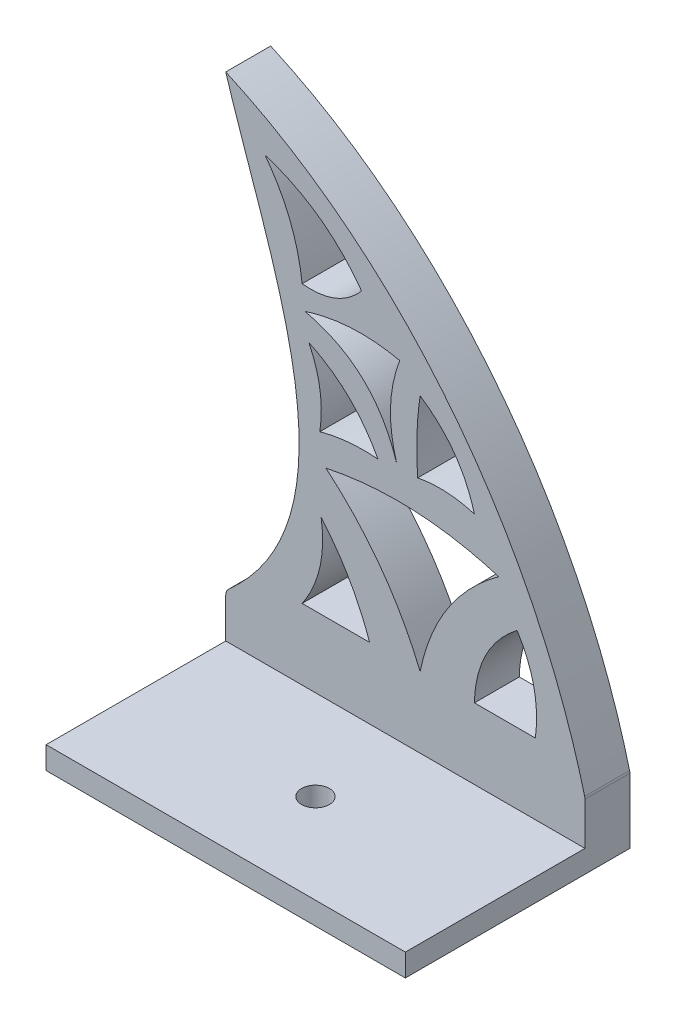
ISO-10303-21;
HEADER;
FILE_DESCRIPTION(('STEP AP214'),'2;1');
FILE_NAME('part.step','',(''),(''),'','','');
FILE_SCHEMA(('AUTOMOTIVE_DESIGN { 1 0 10303 214 1 1 1 1 }'));
ENDSEC;
DATA;
#1=APPLICATION_CONTEXT('core data for automotive mechanical design processes');
#2=APPLICATION_PROTOCOL_DEFINITION('international standard','automotive_design',2000,#1);
#3=PRODUCT_CONTEXT('',#1,'mechanical');
#4=PRODUCT('Part','Part','',(#3));
#5=PRODUCT_RELATED_PRODUCT_CATEGORY('part','',(#4));
#6=PRODUCT_DEFINITION_FORMATION('','',#4);
#7=PRODUCT_DEFINITION_CONTEXT('part definition',#1,'design');
#8=PRODUCT_DEFINITION('design','',#6,#7);
#9=PRODUCT_DEFINITION_SHAPE('','',#8);
#10=(LENGTH_UNIT() NAMED_UNIT(*) SI_UNIT(.MILLI.,.METRE.));
#11=(NAMED_UNIT(*) PLANE_ANGLE_UNIT() SI_UNIT($,.RADIAN.));
#12=(NAMED_UNIT(*) SI_UNIT($,.STERADIAN.) SOLID_ANGLE_UNIT());
#13=UNCERTAINTY_MEASURE_WITH_UNIT(LENGTH_MEASURE(1.E-05),#10,'distance_accuracy_value','');
#14=(GEOMETRIC_REPRESENTATION_CONTEXT(3) GLOBAL_UNCERTAINTY_ASSIGNED_CONTEXT((#13)) GLOBAL_UNIT_ASSIGNED_CONTEXT((#10,
#11,#12)) REPRESENTATION_CONTEXT('',''));
#15=CARTESIAN_POINT('',(0.,0.,0.));
#16=DIRECTION('',(0.,0.,1.));
#17=DIRECTION('',(1.,0.,0.));
#18=AXIS2_PLACEMENT_3D('',#15,#16,#17);
#19=CARTESIAN_POINT('',(0.,0.,12.7));
#20=DIRECTION('',(-1.,0.,0.));
#21=DIRECTION('',(0.,0.,1.));
#22=AXIS2_PLACEMENT_3D('',#19,#20,#21);
#23=PLANE('',#22);
#24=DIRECTION('',(0.,1.,0.));
#25=VECTOR('',#24,1.);
#26=CARTESIAN_POINT('',(0.,0.,0.));
#27=LINE('',#26,#25);
#28=CARTESIAN_POINT('',(0.,133.663922723156,0.));
#29=VERTEX_POINT('',#28);
#30=CARTESIAN_POINT('',(0.,151.251284081008,0.));
#31=VERTEX_POINT('',#30);
#32=EDGE_CURVE('E365',#29,#31,#27,.T.);
#33=ORIENTED_EDGE('',*,*,#32,.F.);
#34=DIRECTION('',(0.,0.,1.));
#35=VECTOR('',#34,1.);
#36=CARTESIAN_POINT('',(0.,133.663922723156,0.));
#37=LINE('',#36,#35);
#38=CARTESIAN_POINT('',(0.,133.663922723156,63.5));
#39=VERTEX_POINT('',#38);
#40=EDGE_CURVE('E71',#29,#39,#37,.T.);
#41=ORIENTED_EDGE('',*,*,#40,.T.);
#42=DIRECTION('',(0.,-1.,0.));
#43=VECTOR('',#42,1.);
#44=CARTESIAN_POINT('',(0.,133.663922723156,63.5));
#45=LINE('',#44,#43);
#46=CARTESIAN_POINT('',(0.,140.013922723156,63.5));
#47=VERTEX_POINT('',#46);
#48=EDGE_CURVE('E255',#47,#39,#45,.T.);
#49=ORIENTED_EDGE('',*,*,#48,.F.);
#50=DIRECTION('',(0.,0.,-1.));
#51=VECTOR('',#50,1.);
#52=CARTESIAN_POINT('',(0.,140.013922723156,63.5));
#53=LINE('',#52,#51);
#54=CARTESIAN_POINT('',(0.,140.013922723156,12.7));
#55=VERTEX_POINT('',#54);
#56=EDGE_CURVE('E250',#47,#55,#53,.T.);
#57=ORIENTED_EDGE('',*,*,#56,.T.);
#58=DIRECTION('',(0.,1.,0.));
#59=VECTOR('',#58,1.);
#60=CARTESIAN_POINT('',(0.,0.,12.7));
#61=LINE('',#60,#59);
#62=CARTESIAN_POINT('',(0.,151.251284081008,12.7));
#63=VERTEX_POINT('',#62);
#64=EDGE_CURVE('E364',#55,#63,#61,.T.);
#65=ORIENTED_EDGE('',*,*,#64,.T.);
#66=DIRECTION('',(0.,0.,-1.));
#67=VECTOR('',#66,1.);
#68=CARTESIAN_POINT('',(0.,151.251284081008,12.7));
#69=LINE('',#68,#67);
#70=EDGE_CURVE('E56',#63,#31,#69,.T.);
#71=ORIENTED_EDGE('',*,*,#70,.T.);
#72=EDGE_LOOP('',(#33,#41,#49,#57,#65,#71));
#73=FACE_BOUND('',#72,.T.);
#74=ADVANCED_FACE('F47',(#73),#23,.T.);
#75=CARTESIAN_POINT('',(101.6,0.,12.7));
#76=DIRECTION('',(-1.,0.,0.));
#77=DIRECTION('',(0.,0.,1.));
#78=AXIS2_PLACEMENT_3D('',#75,#76,#77);
#79=PLANE('',#78);
#80=DIRECTION('',(0.,0.,1.));
#81=VECTOR('',#80,1.);
#82=CARTESIAN_POINT('',(101.6,133.663922723156,0.));
#83=LINE('',#82,#81);
#84=CARTESIAN_POINT('',(101.6,133.663922723156,0.));
#85=VERTEX_POINT('',#84);
#86=CARTESIAN_POINT('',(101.6,133.663922723156,63.5));
#87=VERTEX_POINT('',#86);
#88=EDGE_CURVE('E278',#85,#87,#83,.T.);
#89=ORIENTED_EDGE('',*,*,#88,.F.);
#90=DIRECTION('',(0.,1.,0.));
#91=VECTOR('',#90,1.);
#92=CARTESIAN_POINT('',(101.6,0.,0.));
#93=LINE('',#92,#91);
#94=CARTESIAN_POINT('',(101.6,152.077820816032,0.));
#95=VERTEX_POINT('',#94);
#96=EDGE_CURVE('E368',#85,#95,#93,.T.);
#97=ORIENTED_EDGE('',*,*,#96,.T.);
#98=DIRECTION('',(0.,0.,1.));
#99=VECTOR('',#98,1.);
#100=CARTESIAN_POINT('',(101.6,152.077820816032,12.7));
#101=LINE('',#100,#99);
#102=CARTESIAN_POINT('',(101.6,152.077820816032,12.7));
#103=VERTEX_POINT('',#102);
#104=EDGE_CURVE('E339',#95,#103,#101,.T.);
#105=ORIENTED_EDGE('',*,*,#104,.T.);
#106=DIRECTION('',(0.,1.,0.));
#107=VECTOR('',#106,1.);
#108=CARTESIAN_POINT('',(101.6,0.,12.7));
#109=LINE('',#108,#107);
#110=CARTESIAN_POINT('',(101.6,140.013922723156,12.7));
#111=VERTEX_POINT('',#110);
#112=EDGE_CURVE('E268',#111,#103,#109,.T.);
#113=ORIENTED_EDGE('',*,*,#112,.F.);
#114=DIRECTION('',(0.,0.,-1.));
#115=VECTOR('',#114,1.);
#116=CARTESIAN_POINT('',(101.6,140.013922723156,63.5));
#117=LINE('',#116,#115);
#118=CARTESIAN_POINT('',(101.6,140.013922723156,63.5));
#119=VERTEX_POINT('',#118);
#120=EDGE_CURVE('E248',#119,#111,#117,.T.);
#121=ORIENTED_EDGE('',*,*,#120,.F.);
#122=DIRECTION('',(0.,1.,0.));
#123=VECTOR('',#122,1.);
#124=CARTESIAN_POINT('',(101.6,133.663922723156,63.5));
#125=LINE('',#124,#123);
#126=EDGE_CURVE('E256',#87,#119,#125,.T.);
#127=ORIENTED_EDGE('',*,*,#126,.F.);
#128=EDGE_LOOP('',(#89,#97,#105,#113,#121,#127));
#129=FACE_BOUND('',#128,.T.);
#130=ADVANCED_FACE('F266',(#129),#79,.F.);
#131=CARTESIAN_POINT('',(0.,0.,12.7));
#132=DIRECTION('',(0.,0.,1.));
#133=DIRECTION('',(1.,0.,0.));
#134=AXIS2_PLACEMENT_3D('',#131,#132,#133);
#135=PLANE('',#134);
#136=DIRECTION('',(-1.,0.,0.));
#137=VECTOR('',#136,1.);
#138=CARTESIAN_POINT('',(101.6,140.013922723156,12.7));
#139=LINE('',#138,#137);
#140=EDGE_CURVE('E63',#111,#55,#139,.T.);
#141=ORIENTED_EDGE('',*,*,#140,.F.);
#142=ORIENTED_EDGE('',*,*,#112,.T.);
#143=CARTESIAN_POINT('',(99.06,152.077820816032,12.7));
#144=DIRECTION('',(0.,0.,1.));
#145=DIRECTION('',(1.,0.,0.));
#146=AXIS2_PLACEMENT_3D('',#143,#144,#145);
#147=CIRCLE('',#146,2.54);
#148=CARTESIAN_POINT('',(101.519048921032,152.713964199217,12.7));
#149=VERTEX_POINT('',#148);
#150=EDGE_CURVE('E338',#103,#149,#147,.T.);
#151=ORIENTED_EDGE('',*,*,#150,.T.);
#152=CARTESIAN_POINT('',(0.,279.4,12.7));
#153=CARTESIAN_POINT('',(51.286050257495,256.550041835225,12.7));
#154=CARTESIAN_POINT('',(87.8368923823486,205.957944637487,12.7));
#155=CARTESIAN_POINT('',(101.6,152.4,12.7));
#156=B_SPLINE_CURVE_WITH_KNOTS('',3,(#152,#153,#154,#155),.UNSPECIFIED.,.F.,.F.,(4,4),(0.,1.),.UNSPECIFIED.);
#157=CARTESIAN_POINT('',(0.,279.4,12.7));
#158=VERTEX_POINT('',#157);
#159=EDGE_CURVE('E778',#158,#149,#156,.T.);
#160=ORIENTED_EDGE('',*,*,#159,.F.);
#161=CARTESIAN_POINT('',(0.,152.4,12.7));
#162=CARTESIAN_POINT('',(39.7901112765311,186.839065643264,12.7));
#163=CARTESIAN_POINT('',(12.3097562496038,238.845497072906,12.7));
#164=CARTESIAN_POINT('',(0.,279.4,12.7));
#165=B_SPLINE_CURVE_WITH_KNOTS('',3,(#161,#162,#163,#164),.UNSPECIFIED.,.F.,.F.,(4,4),(0.,1.),.UNSPECIFIED.);
#166=CARTESIAN_POINT('',(0.847696562527861,153.145408964832,12.7));
#167=VERTEX_POINT('',#166);
#168=EDGE_CURVE('E787',#167,#158,#165,.T.);
#169=ORIENTED_EDGE('',*,*,#168,.F.);
#170=CARTESIAN_POINT('',(2.54,151.251284081008,12.7));
#171=DIRECTION('',(0.,0.,1.));
#172=DIRECTION('',(1.,0.,0.));
#173=AXIS2_PLACEMENT_3D('',#170,#171,#172);
#174=CIRCLE('',#173,2.54);
#175=EDGE_CURVE('E345',#167,#63,#174,.T.);
#176=ORIENTED_EDGE('',*,*,#175,.T.);
#177=ORIENTED_EDGE('',*,*,#64,.F.);
#178=EDGE_LOOP('',(#141,#142,#151,#160,#169,#176,#177));
#179=FACE_BOUND('',#178,.T.);
#180=CARTESIAN_POINT('',(49.2258384870738,233.315766273676,12.7));
#181=CARTESIAN_POINT('',(35.6412289440212,236.267866948693,12.7));
#182=CARTESIAN_POINT('',(22.3756152670284,231.937259722309,12.7));
#183=B_SPLINE_CURVE_WITH_KNOTS('',2,(#180,#181,#182),.UNSPECIFIED.,.F.,.F.,(3,3),(0.,1.),.UNSPECIFIED.);
#184=CARTESIAN_POINT('',(49.2258384870738,233.315766273676,12.7));
#185=VERTEX_POINT('',#184);
#186=CARTESIAN_POINT('',(22.3756152670284,231.937259722309,12.7));
#187=VERTEX_POINT('',#186);
#188=EDGE_CURVE('E284',#185,#187,#183,.T.);
#189=ORIENTED_EDGE('',*,*,#188,.F.);
#190=CARTESIAN_POINT('',(48.4003507205885,207.535437600744,12.7));
#191=CARTESIAN_POINT('',(44.3935689433076,220.734513873405,12.7));
#192=CARTESIAN_POINT('',(49.2258384870738,233.315766273676,12.7));
#193=B_SPLINE_CURVE_WITH_KNOTS('',2,(#190,#191,#192),.UNSPECIFIED.,.F.,.F.,(3,3),(0.,1.),.UNSPECIFIED.);
#194=CARTESIAN_POINT('',(48.4003507205885,207.535437600744,12.7));
#195=VERTEX_POINT('',#194);
#196=EDGE_CURVE('E291',#195,#185,#193,.T.);
#197=ORIENTED_EDGE('',*,*,#196,.F.);
#198=CARTESIAN_POINT('',(48.4003507205885,207.535437600744,12.7));
#199=CARTESIAN_POINT('',(42.0541709012612,227.566198030611,12.7));
#200=CARTESIAN_POINT('',(22.3756152670284,231.937259722309,12.7));
#201=B_SPLINE_CURVE_WITH_KNOTS('',2,(#198,#199,#200),.UNSPECIFIED.,.F.,.F.,(3,3),(0.,1.),.UNSPECIFIED.);
#202=EDGE_CURVE('E1179',#195,#187,#201,.T.);
#203=ORIENTED_EDGE('',*,*,#202,.T.);
#204=EDGE_LOOP('',(#189,#197,#203));
#205=FACE_BOUND('',#204,.T.);
#206=CARTESIAN_POINT('',(43.0534809797926,206.088034939823,12.7));
#207=CARTESIAN_POINT('',(36.2397899942018,218.912660539888,12.7));
#208=CARTESIAN_POINT('',(23.5160663721444,224.861937296205,12.7));
#209=B_SPLINE_CURVE_WITH_KNOTS('',2,(#206,#207,#208),.UNSPECIFIED.,.F.,.F.,(3,3),(0.,1.),.UNSPECIFIED.);
#210=CARTESIAN_POINT('',(43.0534809797926,206.088034939823,12.7));
#211=VERTEX_POINT('',#210);
#212=CARTESIAN_POINT('',(23.5160663721444,224.861937296205,12.7));
#213=VERTEX_POINT('',#212);
#214=EDGE_CURVE('E848',#211,#213,#209,.T.);
#215=ORIENTED_EDGE('',*,*,#214,.F.);
#216=CARTESIAN_POINT('',(26.6057281170054,204.582177714214,12.7));
#217=CARTESIAN_POINT('',(34.7004326090841,206.792891753804,12.7));
#218=CARTESIAN_POINT('',(43.0534809797926,206.088034939823,12.7));
#219=B_SPLINE_CURVE_WITH_KNOTS('',2,(#216,#217,#218),.UNSPECIFIED.,.F.,.F.,(3,3),(0.,1.),.UNSPECIFIED.);
#220=CARTESIAN_POINT('',(26.6057281170054,204.582177714214,12.7));
#221=VERTEX_POINT('',#220);
#222=EDGE_CURVE('E1162',#221,#211,#219,.T.);
#223=ORIENTED_EDGE('',*,*,#222,.F.);
#224=CARTESIAN_POINT('',(23.5160663721444,224.861937296205,12.7));
#225=CARTESIAN_POINT('',(28.2352954071151,215.219272619894,12.7));
#226=CARTESIAN_POINT('',(26.6057281170054,204.582177714214,12.7));
#227=B_SPLINE_CURVE_WITH_KNOTS('',2,(#224,#225,#226),.UNSPECIFIED.,.F.,.F.,(3,3),(0.,1.),.UNSPECIFIED.);
#228=EDGE_CURVE('E1159',#213,#221,#227,.T.);
#229=ORIENTED_EDGE('',*,*,#228,.F.);
#230=EDGE_LOOP('',(#215,#223,#229));
#231=FACE_BOUND('',#230,.T.);
#232=CARTESIAN_POINT('',(82.3960896551855,183.8137177803,12.7));
#233=CARTESIAN_POINT('',(70.6713648996861,174.663598783607,12.7));
#234=CARTESIAN_POINT('',(70.3277731701593,160.02,12.7));
#235=B_SPLINE_CURVE_WITH_KNOTS('',2,(#232,#233,#234),.UNSPECIFIED.,.F.,.F.,(3,3),(0.,1.),.UNSPECIFIED.);
#236=CARTESIAN_POINT('',(82.3960896551855,183.8137177803,12.7));
#237=VERTEX_POINT('',#236);
#238=CARTESIAN_POINT('',(70.3277731701593,160.02,12.7));
#239=VERTEX_POINT('',#238);
#240=EDGE_CURVE('E820',#237,#239,#235,.T.);
#241=ORIENTED_EDGE('',*,*,#240,.F.);
#242=CARTESIAN_POINT('',(82.3960896551855,183.8137177803,12.7));
#243=CARTESIAN_POINT('',(89.3395503674179,172.773814042826,12.7));
#244=CARTESIAN_POINT('',(87.546521436446,160.02,12.7));
#245=B_SPLINE_CURVE_WITH_KNOTS('',2,(#242,#243,#244),.UNSPECIFIED.,.F.,.F.,(3,3),(0.,1.),.UNSPECIFIED.);
#246=CARTESIAN_POINT('',(87.546521436446,160.02,12.7));
#247=VERTEX_POINT('',#246);
#248=EDGE_CURVE('E814',#237,#247,#245,.T.);
#249=ORIENTED_EDGE('',*,*,#248,.T.);
#250=DIRECTION('',(1.,0.,0.));
#251=VECTOR('',#250,1.);
#252=CARTESIAN_POINT('',(0.,160.02,12.7));
#253=LINE('',#252,#251);
#254=EDGE_CURVE('E819',#239,#247,#253,.T.);
#255=ORIENTED_EDGE('',*,*,#254,.F.);
#256=EDGE_LOOP('',(#241,#249,#255));
#257=FACE_BOUND('',#256,.T.);
#258=CARTESIAN_POINT('',(26.9804663757679,183.813742110307,12.7));
#259=CARTESIAN_POINT('',(28.9587756049128,170.83754360767,12.7));
#260=CARTESIAN_POINT('',(21.602944742717,160.02,12.7));
#261=B_SPLINE_CURVE_WITH_KNOTS('',2,(#258,#259,#260),.UNSPECIFIED.,.F.,.F.,(3,3),(0.,1.),.UNSPECIFIED.);
#262=CARTESIAN_POINT('',(26.9804663757679,183.813742110307,12.7));
#263=VERTEX_POINT('',#262);
#264=CARTESIAN_POINT('',(21.602944742717,160.02,12.7));
#265=VERTEX_POINT('',#264);
#266=EDGE_CURVE('E768',#263,#265,#261,.T.);
#267=ORIENTED_EDGE('',*,*,#266,.F.);
#268=CARTESIAN_POINT('',(26.9804663757679,183.813742110307,12.7));
#269=CARTESIAN_POINT('',(36.1384728498924,173.175056715144,12.7));
#270=CARTESIAN_POINT('',(40.6766417755855,160.02,12.7));
#271=B_SPLINE_CURVE_WITH_KNOTS('',2,(#268,#269,#270),.UNSPECIFIED.,.F.,.F.,(3,3),(0.,1.),.UNSPECIFIED.);
#272=CARTESIAN_POINT('',(40.6766417755855,160.02,12.7));
#273=VERTEX_POINT('',#272);
#274=EDGE_CURVE('E762',#263,#273,#271,.T.);
#275=ORIENTED_EDGE('',*,*,#274,.T.);
#276=DIRECTION('',(-1.,0.,0.));
#277=VECTOR('',#276,1.);
#278=CARTESIAN_POINT('',(0.,160.02,12.7));
#279=LINE('',#278,#277);
#280=EDGE_CURVE('E742',#273,#265,#279,.T.);
#281=ORIENTED_EDGE('',*,*,#280,.T.);
#282=EDGE_LOOP('',(#267,#275,#281));
#283=FACE_BOUND('',#282,.T.);
#284=CARTESIAN_POINT('',(54.9770830803954,160.02,12.7));
#285=CARTESIAN_POINT('',(46.0834758399413,181.547553160455,12.7));
#286=CARTESIAN_POINT('',(28.3421369029203,196.52980248231,12.7));
#287=B_SPLINE_CURVE_WITH_KNOTS('',2,(#284,#285,#286),.UNSPECIFIED.,.F.,.F.,(3,3),(0.,1.),.UNSPECIFIED.);
#288=CARTESIAN_POINT('',(54.9770830803954,160.02,12.7));
#289=VERTEX_POINT('',#288);
#290=CARTESIAN_POINT('',(28.3421369029203,196.52980248231,12.7));
#291=VERTEX_POINT('',#290);
#292=EDGE_CURVE('E732',#289,#291,#287,.T.);
#293=ORIENTED_EDGE('',*,*,#292,.T.);
#294=CARTESIAN_POINT('',(28.3421369029203,196.52980248231,12.7));
#295=CARTESIAN_POINT('',(53.0178150021792,201.732288520624,12.7));
#296=CARTESIAN_POINT('',(77.1872044953657,194.363538627742,12.7));
#297=B_SPLINE_CURVE_WITH_KNOTS('',2,(#294,#295,#296),.UNSPECIFIED.,.F.,.F.,(3,3),(0.,1.),.UNSPECIFIED.);
#298=CARTESIAN_POINT('',(77.1872044953657,194.363538627742,12.7));
#299=VERTEX_POINT('',#298);
#300=EDGE_CURVE('E723',#291,#299,#297,.T.);
#301=ORIENTED_EDGE('',*,*,#300,.T.);
#302=CARTESIAN_POINT('',(54.9770830803954,160.02,12.7));
#303=CARTESIAN_POINT('',(59.3747288950181,181.400643158016,12.7));
#304=CARTESIAN_POINT('',(77.1872044953657,194.363538627742,12.7));
#305=B_SPLINE_CURVE_WITH_KNOTS('',2,(#302,#303,#304),.UNSPECIFIED.,.F.,.F.,(3,3),(0.,1.),.UNSPECIFIED.);
#306=EDGE_CURVE('E717',#289,#299,#305,.T.);
#307=ORIENTED_EDGE('',*,*,#306,.F.);
#308=EDGE_LOOP('',(#293,#301,#307));
#309=FACE_BOUND('',#308,.T.);
#310=CARTESIAN_POINT('',(70.3282595613759,206.27745757837,12.7));
#311=CARTESIAN_POINT('',(62.3615769619994,208.669014940846,12.7));
#312=CARTESIAN_POINT('',(54.287141361752,207.109917469007,12.7));
#313=B_SPLINE_CURVE_WITH_KNOTS('',2,(#310,#311,#312),.UNSPECIFIED.,.F.,.F.,(3,3),(0.,1.),.UNSPECIFIED.);
#314=CARTESIAN_POINT('',(70.3282595613759,206.27745757837,12.7));
#315=VERTEX_POINT('',#314);
#316=CARTESIAN_POINT('',(54.287141361752,207.109917469007,12.7));
#317=VERTEX_POINT('',#316);
#318=EDGE_CURVE('E693',#315,#317,#313,.T.);
#319=ORIENTED_EDGE('',*,*,#318,.T.);
#320=CARTESIAN_POINT('',(54.287141361752,207.109917469007,12.7));
#321=CARTESIAN_POINT('',(53.4820968113887,217.391663166995,12.7));
#322=CARTESIAN_POINT('',(54.9770830803954,227.557269011986,12.7));
#323=B_SPLINE_CURVE_WITH_KNOTS('',2,(#320,#321,#322),.UNSPECIFIED.,.F.,.F.,(3,3),(0.,1.),.UNSPECIFIED.);
#324=CARTESIAN_POINT('',(54.9770830803954,227.557269011986,12.7));
#325=VERTEX_POINT('',#324);
#326=EDGE_CURVE('E684',#317,#325,#323,.T.);
#327=ORIENTED_EDGE('',*,*,#326,.T.);
#328=CARTESIAN_POINT('',(54.9770830803954,227.557269011986,12.7));
#329=CARTESIAN_POINT('',(66.6458597542174,219.852180833507,12.7));
#330=CARTESIAN_POINT('',(70.3282595613759,206.27745757837,12.7));
#331=B_SPLINE_CURVE_WITH_KNOTS('',2,(#328,#329,#330),.UNSPECIFIED.,.F.,.F.,(3,3),(0.,1.),.UNSPECIFIED.);
#332=EDGE_CURVE('E675',#325,#315,#331,.T.);
#333=ORIENTED_EDGE('',*,*,#332,.T.);
#334=EDGE_LOOP('',(#319,#327,#333));
#335=FACE_BOUND('',#334,.T.);
#336=CARTESIAN_POINT('',(21.602944742717,238.323137826184,12.7));
#337=CARTESIAN_POINT('',(19.9519756703058,252.974545224531,12.7));
#338=CARTESIAN_POINT('',(11.0947377675254,264.601494060694,12.7));
#339=B_SPLINE_CURVE_WITH_KNOTS('',2,(#336,#337,#338),.UNSPECIFIED.,.F.,.F.,(3,3),(0.,1.),.UNSPECIFIED.);
#340=CARTESIAN_POINT('',(21.602944742717,238.323137826184,12.7));
#341=VERTEX_POINT('',#340);
#342=CARTESIAN_POINT('',(11.0947377675254,264.601494060694,12.7));
#343=VERTEX_POINT('',#342);
#344=EDGE_CURVE('E669',#341,#343,#339,.T.);
#345=ORIENTED_EDGE('',*,*,#344,.T.);
#346=CARTESIAN_POINT('',(11.0947377675254,264.601494060694,12.7));
#347=CARTESIAN_POINT('',(28.0538351864922,259.295838114787,12.7));
#348=CARTESIAN_POINT('',(38.4122672823243,244.949944055659,12.7));
#349=B_SPLINE_CURVE_WITH_KNOTS('',2,(#346,#347,#348),.UNSPECIFIED.,.F.,.F.,(3,3),(0.,1.),.UNSPECIFIED.);
#350=CARTESIAN_POINT('',(38.4122672823243,244.949944055659,12.7));
#351=VERTEX_POINT('',#350);
#352=EDGE_CURVE('E647',#343,#351,#349,.T.);
#353=ORIENTED_EDGE('',*,*,#352,.T.);
#354=CARTESIAN_POINT('',(21.602944742717,238.323137826184,12.7));
#355=CARTESIAN_POINT('',(31.864782778685,237.284469605231,12.7));
#356=CARTESIAN_POINT('',(38.4122672823243,244.949944055659,12.7));
#357=B_SPLINE_CURVE_WITH_KNOTS('',2,(#354,#355,#356),.UNSPECIFIED.,.F.,.F.,(3,3),(0.,1.),.UNSPECIFIED.);
#358=EDGE_CURVE('E386',#341,#351,#357,.T.);
#359=ORIENTED_EDGE('',*,*,#358,.F.);
#360=EDGE_LOOP('',(#345,#353,#359));
#361=FACE_BOUND('',#360,.T.);
#362=ADVANCED_FACE('F309',(#179,#205,#231,#257,#283,#309,#335,#361),#135,.T.);
#363=CARTESIAN_POINT('',(0.,0.,0.));
#364=DIRECTION('',(0.,0.,1.));
#365=DIRECTION('',(1.,0.,0.));
#366=AXIS2_PLACEMENT_3D('',#363,#364,#365);
#367=PLANE('',#366);
#368=CARTESIAN_POINT('',(21.602944742717,238.323137826184,0.));
#369=CARTESIAN_POINT('',(19.9519756703058,252.974545224531,0.));
#370=CARTESIAN_POINT('',(11.0947377675254,264.601494060694,0.));
#371=B_SPLINE_CURVE_WITH_KNOTS('',2,(#368,#369,#370),.UNSPECIFIED.,.F.,.F.,(3,3),(0.,1.),.UNSPECIFIED.);
#372=CARTESIAN_POINT('',(21.602944742717,238.323137826184,0.));
#373=VERTEX_POINT('',#372);
#374=CARTESIAN_POINT('',(11.0947377675254,264.601494060694,0.));
#375=VERTEX_POINT('',#374);
#376=EDGE_CURVE('E463',#373,#375,#371,.T.);
#377=ORIENTED_EDGE('',*,*,#376,.F.);
#378=CARTESIAN_POINT('',(21.602944742717,238.323137826184,0.));
#379=CARTESIAN_POINT('',(31.864782778685,237.284469605231,0.));
#380=CARTESIAN_POINT('',(38.4122672823243,244.949944055659,0.));
#381=B_SPLINE_CURVE_WITH_KNOTS('',2,(#378,#379,#380),.UNSPECIFIED.,.F.,.F.,(3,3),(0.,1.),.UNSPECIFIED.);
#382=CARTESIAN_POINT('',(38.4122672823243,244.949944055659,0.));
#383=VERTEX_POINT('',#382);
#384=EDGE_CURVE('E292',#373,#383,#381,.T.);
#385=ORIENTED_EDGE('',*,*,#384,.T.);
#386=CARTESIAN_POINT('',(11.0947377675254,264.601494060694,0.));
#387=CARTESIAN_POINT('',(28.0538351864922,259.295838114787,0.));
#388=CARTESIAN_POINT('',(38.4122672823243,244.949944055659,0.));
#389=B_SPLINE_CURVE_WITH_KNOTS('',2,(#386,#387,#388),.UNSPECIFIED.,.F.,.F.,(3,3),(0.,1.),.UNSPECIFIED.);
#390=EDGE_CURVE('E454',#375,#383,#389,.T.);
#391=ORIENTED_EDGE('',*,*,#390,.F.);
#392=EDGE_LOOP('',(#377,#385,#391));
#393=FACE_BOUND('',#392,.T.);
#394=CARTESIAN_POINT('',(70.3282595613759,206.27745757837,0.));
#395=CARTESIAN_POINT('',(62.3615769619994,208.669014940846,0.));
#396=CARTESIAN_POINT('',(54.287141361752,207.109917469007,0.));
#397=B_SPLINE_CURVE_WITH_KNOTS('',2,(#394,#395,#396),.UNSPECIFIED.,.F.,.F.,(3,3),(0.,1.),.UNSPECIFIED.);
#398=CARTESIAN_POINT('',(70.3282595613759,206.27745757837,0.));
#399=VERTEX_POINT('',#398);
#400=CARTESIAN_POINT('',(54.287141361752,207.109917469007,0.));
#401=VERTEX_POINT('',#400);
#402=EDGE_CURVE('E488',#399,#401,#397,.T.);
#403=ORIENTED_EDGE('',*,*,#402,.F.);
#404=CARTESIAN_POINT('',(54.9770830803954,227.557269011986,0.));
#405=CARTESIAN_POINT('',(66.6458597542174,219.852180833507,0.));
#406=CARTESIAN_POINT('',(70.3282595613759,206.27745757837,0.));
#407=B_SPLINE_CURVE_WITH_KNOTS('',2,(#404,#405,#406),.UNSPECIFIED.,.F.,.F.,(3,3),(0.,1.),.UNSPECIFIED.);
#408=CARTESIAN_POINT('',(54.9770830803954,227.557269011986,0.));
#409=VERTEX_POINT('',#408);
#410=EDGE_CURVE('E472',#409,#399,#407,.T.);
#411=ORIENTED_EDGE('',*,*,#410,.F.);
#412=CARTESIAN_POINT('',(54.287141361752,207.109917469007,0.));
#413=CARTESIAN_POINT('',(53.4820968113887,217.391663166995,0.));
#414=CARTESIAN_POINT('',(54.9770830803954,227.557269011986,0.));
#415=B_SPLINE_CURVE_WITH_KNOTS('',2,(#412,#413,#414),.UNSPECIFIED.,.F.,.F.,(3,3),(0.,1.),.UNSPECIFIED.);
#416=EDGE_CURVE('E480',#401,#409,#415,.T.);
#417=ORIENTED_EDGE('',*,*,#416,.F.);
#418=EDGE_LOOP('',(#403,#411,#417));
#419=FACE_BOUND('',#418,.T.);
#420=CARTESIAN_POINT('',(54.9770830803954,160.02,0.));
#421=CARTESIAN_POINT('',(46.0834758399413,181.547553160455,0.));
#422=CARTESIAN_POINT('',(28.3421369029203,196.52980248231,0.));
#423=B_SPLINE_CURVE_WITH_KNOTS('',2,(#420,#421,#422),.UNSPECIFIED.,.F.,.F.,(3,3),(0.,1.),.UNSPECIFIED.);
#424=CARTESIAN_POINT('',(54.9770830803954,160.02,0.));
#425=VERTEX_POINT('',#424);
#426=CARTESIAN_POINT('',(28.3421369029203,196.52980248231,0.));
#427=VERTEX_POINT('',#426);
#428=EDGE_CURVE('E515',#425,#427,#423,.T.);
#429=ORIENTED_EDGE('',*,*,#428,.F.);
#430=CARTESIAN_POINT('',(54.9770830803954,160.02,0.));
#431=CARTESIAN_POINT('',(59.3747288950181,181.400643158016,0.));
#432=CARTESIAN_POINT('',(77.1872044953657,194.363538627742,0.));
#433=B_SPLINE_CURVE_WITH_KNOTS('',2,(#430,#431,#432),.UNSPECIFIED.,.F.,.F.,(3,3),(0.,1.),.UNSPECIFIED.);
#434=CARTESIAN_POINT('',(77.1872044953657,194.363538627742,0.));
#435=VERTEX_POINT('',#434);
#436=EDGE_CURVE('E497',#425,#435,#433,.T.);
#437=ORIENTED_EDGE('',*,*,#436,.T.);
#438=CARTESIAN_POINT('',(28.3421369029203,196.52980248231,0.));
#439=CARTESIAN_POINT('',(53.0178150021792,201.732288520624,0.));
#440=CARTESIAN_POINT('',(77.1872044953657,194.363538627742,0.));
#441=B_SPLINE_CURVE_WITH_KNOTS('',2,(#438,#439,#440),.UNSPECIFIED.,.F.,.F.,(3,3),(0.,1.),.UNSPECIFIED.);
#442=EDGE_CURVE('E506',#427,#435,#441,.T.);
#443=ORIENTED_EDGE('',*,*,#442,.F.);
#444=EDGE_LOOP('',(#429,#437,#443));
#445=FACE_BOUND('',#444,.T.);
#446=CARTESIAN_POINT('',(26.9804663757679,183.813742110307,0.));
#447=CARTESIAN_POINT('',(28.9587756049128,170.83754360767,0.));
#448=CARTESIAN_POINT('',(21.602944742717,160.02,0.));
#449=B_SPLINE_CURVE_WITH_KNOTS('',2,(#446,#447,#448),.UNSPECIFIED.,.F.,.F.,(3,3),(0.,1.),.UNSPECIFIED.);
#450=CARTESIAN_POINT('',(26.9804663757679,183.813742110307,0.));
#451=VERTEX_POINT('',#450);
#452=CARTESIAN_POINT('',(21.602944742717,160.02,0.));
#453=VERTEX_POINT('',#452);
#454=EDGE_CURVE('E537',#451,#453,#449,.T.);
#455=ORIENTED_EDGE('',*,*,#454,.T.);
#456=DIRECTION('',(-1.,0.,0.));
#457=VECTOR('',#456,1.);
#458=CARTESIAN_POINT('',(0.,160.02,0.));
#459=LINE('',#458,#457);
#460=CARTESIAN_POINT('',(40.6766417755855,160.02,0.));
#461=VERTEX_POINT('',#460);
#462=EDGE_CURVE('E524',#461,#453,#459,.T.);
#463=ORIENTED_EDGE('',*,*,#462,.F.);
#464=CARTESIAN_POINT('',(26.9804663757679,183.813742110307,0.));
#465=CARTESIAN_POINT('',(36.1384728498924,173.175056715144,0.));
#466=CARTESIAN_POINT('',(40.6766417755855,160.02,0.));
#467=B_SPLINE_CURVE_WITH_KNOTS('',2,(#464,#465,#466),.UNSPECIFIED.,.F.,.F.,(3,3),(0.,1.),.UNSPECIFIED.);
#468=EDGE_CURVE('E531',#451,#461,#467,.T.);
#469=ORIENTED_EDGE('',*,*,#468,.F.);
#470=EDGE_LOOP('',(#455,#463,#469));
#471=FACE_BOUND('',#470,.T.);
#472=CARTESIAN_POINT('',(82.3960896551855,183.8137177803,0.));
#473=CARTESIAN_POINT('',(70.6713648996861,174.663598783607,0.));
#474=CARTESIAN_POINT('',(70.3277731701593,160.02,0.));
#475=B_SPLINE_CURVE_WITH_KNOTS('',2,(#472,#473,#474),.UNSPECIFIED.,.F.,.F.,(3,3),(0.,1.),.UNSPECIFIED.);
#476=CARTESIAN_POINT('',(82.3960896551855,183.8137177803,0.));
#477=VERTEX_POINT('',#476);
#478=CARTESIAN_POINT('',(70.3277731701593,160.02,0.));
#479=VERTEX_POINT('',#478);
#480=EDGE_CURVE('E576',#477,#479,#475,.T.);
#481=ORIENTED_EDGE('',*,*,#480,.T.);
#482=DIRECTION('',(1.,0.,0.));
#483=VECTOR('',#482,1.);
#484=CARTESIAN_POINT('',(0.,160.02,0.));
#485=LINE('',#484,#483);
#486=CARTESIAN_POINT('',(87.546521436446,160.02,0.));
#487=VERTEX_POINT('',#486);
#488=EDGE_CURVE('E563',#479,#487,#485,.T.);
#489=ORIENTED_EDGE('',*,*,#488,.T.);
#490=CARTESIAN_POINT('',(82.3960896551855,183.8137177803,0.));
#491=CARTESIAN_POINT('',(89.3395503674179,172.773814042826,0.));
#492=CARTESIAN_POINT('',(87.546521436446,160.02,0.));
#493=B_SPLINE_CURVE_WITH_KNOTS('',2,(#490,#491,#492),.UNSPECIFIED.,.F.,.F.,(3,3),(0.,1.),.UNSPECIFIED.);
#494=EDGE_CURVE('E570',#477,#487,#493,.T.);
#495=ORIENTED_EDGE('',*,*,#494,.F.);
#496=EDGE_LOOP('',(#481,#489,#495));
#497=FACE_BOUND('',#496,.T.);
#498=CARTESIAN_POINT('',(43.0534809797926,206.088034939823,0.));
#499=CARTESIAN_POINT('',(36.2397899942018,218.912660539888,0.));
#500=CARTESIAN_POINT('',(23.5160663721444,224.861937296205,0.));
#501=B_SPLINE_CURVE_WITH_KNOTS('',2,(#498,#499,#500),.UNSPECIFIED.,.F.,.F.,(3,3),(0.,1.),.UNSPECIFIED.);
#502=CARTESIAN_POINT('',(43.0534809797926,206.088034939823,0.));
#503=VERTEX_POINT('',#502);
#504=CARTESIAN_POINT('',(23.5160663721444,224.861937296205,0.));
#505=VERTEX_POINT('',#504);
#506=EDGE_CURVE('E603',#503,#505,#501,.T.);
#507=ORIENTED_EDGE('',*,*,#506,.T.);
#508=CARTESIAN_POINT('',(23.5160663721444,224.861937296205,0.));
#509=CARTESIAN_POINT('',(28.2352954071151,215.219272619894,0.));
#510=CARTESIAN_POINT('',(26.6057281170054,204.582177714214,0.));
#511=B_SPLINE_CURVE_WITH_KNOTS('',2,(#508,#509,#510),.UNSPECIFIED.,.F.,.F.,(3,3),(0.,1.),.UNSPECIFIED.);
#512=CARTESIAN_POINT('',(26.6057281170054,204.582177714214,0.));
#513=VERTEX_POINT('',#512);
#514=EDGE_CURVE('E585',#505,#513,#511,.T.);
#515=ORIENTED_EDGE('',*,*,#514,.T.);
#516=CARTESIAN_POINT('',(26.6057281170054,204.582177714214,0.));
#517=CARTESIAN_POINT('',(34.7004326090841,206.792891753804,0.));
#518=CARTESIAN_POINT('',(43.0534809797926,206.088034939823,0.));
#519=B_SPLINE_CURVE_WITH_KNOTS('',2,(#516,#517,#518),.UNSPECIFIED.,.F.,.F.,(3,3),(0.,1.),.UNSPECIFIED.);
#520=EDGE_CURVE('E594',#513,#503,#519,.T.);
#521=ORIENTED_EDGE('',*,*,#520,.T.);
#522=EDGE_LOOP('',(#507,#515,#521));
#523=FACE_BOUND('',#522,.T.);
#524=CARTESIAN_POINT('',(49.2258384870738,233.315766273676,0.));
#525=CARTESIAN_POINT('',(35.6412289440212,236.267866948693,0.));
#526=CARTESIAN_POINT('',(22.3756152670284,231.937259722309,0.));
#527=B_SPLINE_CURVE_WITH_KNOTS('',2,(#524,#525,#526),.UNSPECIFIED.,.F.,.F.,(3,3),(0.,1.),.UNSPECIFIED.);
#528=CARTESIAN_POINT('',(49.2258384870738,233.315766273676,0.));
#529=VERTEX_POINT('',#528);
#530=CARTESIAN_POINT('',(22.3756152670284,231.937259722309,0.));
#531=VERTEX_POINT('',#530);
#532=EDGE_CURVE('E281',#529,#531,#527,.T.);
#533=ORIENTED_EDGE('',*,*,#532,.T.);
#534=CARTESIAN_POINT('',(48.4003507205885,207.535437600744,0.));
#535=CARTESIAN_POINT('',(42.0541709012612,227.566198030611,0.));
#536=CARTESIAN_POINT('',(22.3756152670284,231.937259722309,0.));
#537=B_SPLINE_CURVE_WITH_KNOTS('',2,(#534,#535,#536),.UNSPECIFIED.,.F.,.F.,(3,3),(0.,1.),.UNSPECIFIED.);
#538=CARTESIAN_POINT('',(48.4003507205885,207.535437600744,0.));
#539=VERTEX_POINT('',#538);
#540=EDGE_CURVE('E612',#539,#531,#537,.T.);
#541=ORIENTED_EDGE('',*,*,#540,.F.);
#542=CARTESIAN_POINT('',(48.4003507205885,207.535437600744,0.));
#543=CARTESIAN_POINT('',(44.3935689433076,220.734513873405,0.));
#544=CARTESIAN_POINT('',(49.2258384870738,233.315766273676,0.));
#545=B_SPLINE_CURVE_WITH_KNOTS('',2,(#542,#543,#544),.UNSPECIFIED.,.F.,.F.,(3,3),(0.,1.),.UNSPECIFIED.);
#546=EDGE_CURVE('E621',#539,#529,#545,.T.);
#547=ORIENTED_EDGE('',*,*,#546,.T.);
#548=EDGE_LOOP('',(#533,#541,#547));
#549=FACE_BOUND('',#548,.T.);
#550=DIRECTION('',(1.,0.,0.));
#551=VECTOR('',#550,1.);
#552=CARTESIAN_POINT('',(0.,133.663922723156,0.));
#553=LINE('',#552,#551);
#554=EDGE_CURVE('E270',#29,#85,#553,.T.);
#555=ORIENTED_EDGE('',*,*,#554,.F.);
#556=ORIENTED_EDGE('',*,*,#32,.T.);
#557=CARTESIAN_POINT('',(2.54,151.251284081008,0.));
#558=DIRECTION('',(0.,0.,1.));
#559=DIRECTION('',(1.,0.,0.));
#560=AXIS2_PLACEMENT_3D('',#557,#558,#559);
#561=CIRCLE('',#560,2.54);
#562=CARTESIAN_POINT('',(0.847696562527882,153.145408964832,0.));
#563=VERTEX_POINT('',#562);
#564=EDGE_CURVE('E359',#31,#563,#561,.F.);
#565=ORIENTED_EDGE('',*,*,#564,.T.);
#566=CARTESIAN_POINT('',(0.,152.4,0.));
#567=CARTESIAN_POINT('',(39.7901112765311,186.839065643264,0.));
#568=CARTESIAN_POINT('',(12.3097562496038,238.845497072906,0.));
#569=CARTESIAN_POINT('',(0.,279.4,0.));
#570=B_SPLINE_CURVE_WITH_KNOTS('',3,(#566,#567,#568,#569),.UNSPECIFIED.,.F.,.F.,(4,4),(0.,1.),.UNSPECIFIED.);
#571=CARTESIAN_POINT('',(0.,279.4,0.));
#572=VERTEX_POINT('',#571);
#573=EDGE_CURVE('E555',#563,#572,#570,.T.);
#574=ORIENTED_EDGE('',*,*,#573,.T.);
#575=CARTESIAN_POINT('',(0.,279.4,0.));
#576=CARTESIAN_POINT('',(51.286050257495,256.550041835225,0.));
#577=CARTESIAN_POINT('',(87.8368923823486,205.957944637487,0.));
#578=CARTESIAN_POINT('',(101.6,152.4,0.));
#579=B_SPLINE_CURVE_WITH_KNOTS('',3,(#575,#576,#577,#578),.UNSPECIFIED.,.F.,.F.,(4,4),(0.,1.),.UNSPECIFIED.);
#580=CARTESIAN_POINT('',(101.519048921032,152.713964199217,0.));
#581=VERTEX_POINT('',#580);
#582=EDGE_CURVE('E546',#572,#581,#579,.T.);
#583=ORIENTED_EDGE('',*,*,#582,.T.);
#584=CARTESIAN_POINT('',(99.06,152.077820816032,0.));
#585=DIRECTION('',(0.,0.,1.));
#586=DIRECTION('',(1.,0.,0.));
#587=AXIS2_PLACEMENT_3D('',#584,#585,#586);
#588=CIRCLE('',#587,2.54);
#589=EDGE_CURVE('E355',#581,#95,#588,.F.);
#590=ORIENTED_EDGE('',*,*,#589,.T.);
#591=ORIENTED_EDGE('',*,*,#96,.F.);
#592=EDGE_LOOP('',(#555,#556,#565,#574,#583,#590,#591));
#593=FACE_BOUND('',#592,.T.);
#594=ADVANCED_FACE('F312',(#393,#419,#445,#471,#497,#523,#549,#593),#367,.F.);
#595=DIRECTION('',(0.,0.,-1.));
#596=VECTOR('',#595,1.);
#597=SURFACE_OF_LINEAR_EXTRUSION('',#339,#596);
#598=ORIENTED_EDGE('',*,*,#376,.T.);
#599=DIRECTION('',(0.,0.,-1.));
#600=VECTOR('',#599,1.);
#601=CARTESIAN_POINT('',(11.0947377675254,264.601494060694,12.7));
#602=LINE('',#601,#600);
#603=EDGE_CURVE('E371',#343,#375,#602,.T.);
#604=ORIENTED_EDGE('',*,*,#603,.F.);
#605=ORIENTED_EDGE('',*,*,#344,.F.);
#606=DIRECTION('',(0.,0.,-1.));
#607=VECTOR('',#606,1.);
#608=CARTESIAN_POINT('',(21.602944742717,238.323137826184,12.7));
#609=LINE('',#608,#607);
#610=EDGE_CURVE('E433',#341,#373,#609,.T.);
#611=ORIENTED_EDGE('',*,*,#610,.T.);
#612=EDGE_LOOP('',(#598,#604,#605,#611));
#613=FACE_BOUND('',#612,.T.);
#614=ADVANCED_FACE('F315',(#613),#597,.F.);
#615=DIRECTION('',(0.,0.,-1.));
#616=VECTOR('',#615,1.);
#617=SURFACE_OF_LINEAR_EXTRUSION('',#349,#616);
#618=ORIENTED_EDGE('',*,*,#390,.T.);
#619=DIRECTION('',(0.,0.,-1.));
#620=VECTOR('',#619,1.);
#621=CARTESIAN_POINT('',(38.4122672823243,244.949944055659,12.7));
#622=LINE('',#621,#620);
#623=EDGE_CURVE('E444',#351,#383,#622,.T.);
#624=ORIENTED_EDGE('',*,*,#623,.F.);
#625=ORIENTED_EDGE('',*,*,#352,.F.);
#626=ORIENTED_EDGE('',*,*,#603,.T.);
#627=EDGE_LOOP('',(#618,#624,#625,#626));
#628=FACE_BOUND('',#627,.T.);
#629=ADVANCED_FACE('F658',(#628),#617,.F.);
#630=DIRECTION('',(0.,0.,-1.));
#631=VECTOR('',#630,1.);
#632=SURFACE_OF_LINEAR_EXTRUSION('',#313,#631);
#633=ORIENTED_EDGE('',*,*,#402,.T.);
#634=DIRECTION('',(0.,0.,-1.));
#635=VECTOR('',#634,1.);
#636=CARTESIAN_POINT('',(54.287141361752,207.109917469007,12.7));
#637=LINE('',#636,#635);
#638=EDGE_CURVE('E429',#317,#401,#637,.T.);
#639=ORIENTED_EDGE('',*,*,#638,.F.);
#640=ORIENTED_EDGE('',*,*,#318,.F.);
#641=DIRECTION('',(0.,0.,-1.));
#642=VECTOR('',#641,1.);
#643=CARTESIAN_POINT('',(70.3282595613759,206.27745757837,12.7));
#644=LINE('',#643,#642);
#645=EDGE_CURVE('E423',#315,#399,#644,.T.);
#646=ORIENTED_EDGE('',*,*,#645,.T.);
#647=EDGE_LOOP('',(#633,#639,#640,#646));
#648=FACE_BOUND('',#647,.T.);
#649=ADVANCED_FACE('F661',(#648),#632,.F.);
#650=DIRECTION('',(0.,0.,-1.));
#651=VECTOR('',#650,1.);
#652=SURFACE_OF_LINEAR_EXTRUSION('',#323,#651);
#653=ORIENTED_EDGE('',*,*,#416,.T.);
#654=DIRECTION('',(0.,0.,-1.));
#655=VECTOR('',#654,1.);
#656=CARTESIAN_POINT('',(54.9770830803954,227.557269011986,12.7));
#657=LINE('',#656,#655);
#658=EDGE_CURVE('E434',#325,#409,#657,.T.);
#659=ORIENTED_EDGE('',*,*,#658,.F.);
#660=ORIENTED_EDGE('',*,*,#326,.F.);
#661=ORIENTED_EDGE('',*,*,#638,.T.);
#662=EDGE_LOOP('',(#653,#659,#660,#661));
#663=FACE_BOUND('',#662,.T.);
#664=ADVANCED_FACE('F701',(#663),#652,.F.);
#665=DIRECTION('',(0.,0.,-1.));
#666=VECTOR('',#665,1.);
#667=SURFACE_OF_LINEAR_EXTRUSION('',#287,#666);
#668=ORIENTED_EDGE('',*,*,#428,.T.);
#669=DIRECTION('',(0.,0.,-1.));
#670=VECTOR('',#669,1.);
#671=CARTESIAN_POINT('',(28.3421369029203,196.52980248231,12.7));
#672=LINE('',#671,#670);
#673=EDGE_CURVE('E419',#291,#427,#672,.T.);
#674=ORIENTED_EDGE('',*,*,#673,.F.);
#675=ORIENTED_EDGE('',*,*,#292,.F.);
#676=DIRECTION('',(0.,0.,-1.));
#677=VECTOR('',#676,1.);
#678=CARTESIAN_POINT('',(54.9770830803954,160.02,12.7));
#679=LINE('',#678,#677);
#680=EDGE_CURVE('E412',#289,#425,#679,.T.);
#681=ORIENTED_EDGE('',*,*,#680,.T.);
#682=EDGE_LOOP('',(#668,#674,#675,#681));
#683=FACE_BOUND('',#682,.T.);
#684=ADVANCED_FACE('F704',(#683),#667,.F.);
#685=DIRECTION('',(0.,0.,-1.));
#686=VECTOR('',#685,1.);
#687=SURFACE_OF_LINEAR_EXTRUSION('',#297,#686);
#688=ORIENTED_EDGE('',*,*,#442,.T.);
#689=DIRECTION('',(0.,0.,-1.));
#690=VECTOR('',#689,1.);
#691=CARTESIAN_POINT('',(77.1872044953657,194.363538627742,12.7));
#692=LINE('',#691,#690);
#693=EDGE_CURVE('E424',#299,#435,#692,.T.);
#694=ORIENTED_EDGE('',*,*,#693,.F.);
#695=ORIENTED_EDGE('',*,*,#300,.F.);
#696=ORIENTED_EDGE('',*,*,#673,.T.);
#697=EDGE_LOOP('',(#688,#694,#695,#696));
#698=FACE_BOUND('',#697,.T.);
#699=ADVANCED_FACE('F714',(#698),#687,.F.);
#700=DIRECTION('',(0.,0.,-1.));
#701=VECTOR('',#700,1.);
#702=SURFACE_OF_LINEAR_EXTRUSION('',#261,#701);
#703=ORIENTED_EDGE('',*,*,#454,.F.);
#704=DIRECTION('',(0.,0.,-1.));
#705=VECTOR('',#704,1.);
#706=CARTESIAN_POINT('',(26.9804663757679,183.813742110307,12.7));
#707=LINE('',#706,#705);
#708=EDGE_CURVE('E409',#263,#451,#707,.T.);
#709=ORIENTED_EDGE('',*,*,#708,.F.);
#710=ORIENTED_EDGE('',*,*,#266,.T.);
#711=DIRECTION('',(0.,0.,-1.));
#712=VECTOR('',#711,1.);
#713=CARTESIAN_POINT('',(21.602944742717,160.02,12.7));
#714=LINE('',#713,#712);
#715=EDGE_CURVE('E408',#265,#453,#714,.T.);
#716=ORIENTED_EDGE('',*,*,#715,.T.);
#717=EDGE_LOOP('',(#703,#709,#710,#716));
#718=FACE_BOUND('',#717,.T.);
#719=ADVANCED_FACE('F758',(#718),#702,.T.);
#720=DIRECTION('',(0.,0.,-1.));
#721=VECTOR('',#720,1.);
#722=SURFACE_OF_LINEAR_EXTRUSION('',#271,#721);
#723=ORIENTED_EDGE('',*,*,#468,.T.);
#724=DIRECTION('',(0.,0.,-1.));
#725=VECTOR('',#724,1.);
#726=CARTESIAN_POINT('',(40.6766417755855,160.02,12.7));
#727=LINE('',#726,#725);
#728=EDGE_CURVE('E413',#273,#461,#727,.T.);
#729=ORIENTED_EDGE('',*,*,#728,.F.);
#730=ORIENTED_EDGE('',*,*,#274,.F.);
#731=ORIENTED_EDGE('',*,*,#708,.T.);
#732=EDGE_LOOP('',(#723,#729,#730,#731));
#733=FACE_BOUND('',#732,.T.);
#734=ADVANCED_FACE('F754',(#733),#722,.F.);
#735=DIRECTION('',(0.,0.,-1.));
#736=VECTOR('',#735,1.);
#737=SURFACE_OF_LINEAR_EXTRUSION('',#165,#736);
#738=ORIENTED_EDGE('',*,*,#573,.F.);
#739=DIRECTION('',(0.,0.,-1.));
#740=VECTOR('',#739,1.);
#741=CARTESIAN_POINT('',(0.847696562528074,153.145408964832,0.));
#742=LINE('',#741,#740);
#743=EDGE_CURVE('E11',#563,#167,#742,.F.);
#744=ORIENTED_EDGE('',*,*,#743,.T.);
#745=ORIENTED_EDGE('',*,*,#168,.T.);
#746=DIRECTION('',(0.,0.,-1.));
#747=VECTOR('',#746,1.);
#748=CARTESIAN_POINT('',(0.,279.4,12.7));
#749=LINE('',#748,#747);
#750=EDGE_CURVE('E399',#158,#572,#749,.T.);
#751=ORIENTED_EDGE('',*,*,#750,.T.);
#752=EDGE_LOOP('',(#738,#744,#745,#751));
#753=FACE_BOUND('',#752,.T.);
#754=ADVANCED_FACE('F757',(#753),#737,.T.);
#755=DIRECTION('',(0.,0.,-1.));
#756=VECTOR('',#755,1.);
#757=SURFACE_OF_LINEAR_EXTRUSION('',#235,#756);
#758=ORIENTED_EDGE('',*,*,#480,.F.);
#759=DIRECTION('',(0.,0.,-1.));
#760=VECTOR('',#759,1.);
#761=CARTESIAN_POINT('',(82.3960896551855,183.8137177803,12.7));
#762=LINE('',#761,#760);
#763=EDGE_CURVE('E396',#237,#477,#762,.T.);
#764=ORIENTED_EDGE('',*,*,#763,.F.);
#765=ORIENTED_EDGE('',*,*,#240,.T.);
#766=DIRECTION('',(0.,0.,-1.));
#767=VECTOR('',#766,1.);
#768=CARTESIAN_POINT('',(70.3277731701593,160.02,12.7));
#769=LINE('',#768,#767);
#770=EDGE_CURVE('E390',#239,#479,#769,.T.);
#771=ORIENTED_EDGE('',*,*,#770,.T.);
#772=EDGE_LOOP('',(#758,#764,#765,#771));
#773=FACE_BOUND('',#772,.T.);
#774=ADVANCED_FACE('F800',(#773),#757,.T.);
#775=DIRECTION('',(0.,0.,-1.));
#776=VECTOR('',#775,1.);
#777=SURFACE_OF_LINEAR_EXTRUSION('',#245,#776);
#778=ORIENTED_EDGE('',*,*,#494,.T.);
#779=DIRECTION('',(0.,0.,-1.));
#780=VECTOR('',#779,1.);
#781=CARTESIAN_POINT('',(87.546521436446,160.02,12.7));
#782=LINE('',#781,#780);
#783=EDGE_CURVE('E400',#247,#487,#782,.T.);
#784=ORIENTED_EDGE('',*,*,#783,.F.);
#785=ORIENTED_EDGE('',*,*,#248,.F.);
#786=ORIENTED_EDGE('',*,*,#763,.T.);
#787=EDGE_LOOP('',(#778,#784,#785,#786));
#788=FACE_BOUND('',#787,.T.);
#789=ADVANCED_FACE('F806',(#788),#777,.F.);
#790=DIRECTION('',(0.,0.,-1.));
#791=VECTOR('',#790,1.);
#792=SURFACE_OF_LINEAR_EXTRUSION('',#209,#791);
#793=ORIENTED_EDGE('',*,*,#506,.F.);
#794=DIRECTION('',(0.,0.,-1.));
#795=VECTOR('',#794,1.);
#796=CARTESIAN_POINT('',(43.0534809797926,206.088034939823,12.7));
#797=LINE('',#796,#795);
#798=EDGE_CURVE('E387',#211,#503,#797,.T.);
#799=ORIENTED_EDGE('',*,*,#798,.F.);
#800=ORIENTED_EDGE('',*,*,#214,.T.);
#801=DIRECTION('',(0.,0.,-1.));
#802=VECTOR('',#801,1.);
#803=CARTESIAN_POINT('',(23.5160663721444,224.861937296205,12.7));
#804=LINE('',#803,#802);
#805=EDGE_CURVE('E379',#213,#505,#804,.T.);
#806=ORIENTED_EDGE('',*,*,#805,.T.);
#807=EDGE_LOOP('',(#793,#799,#800,#806));
#808=FACE_BOUND('',#807,.T.);
#809=ADVANCED_FACE('F810',(#808),#792,.T.);
#810=DIRECTION('',(0.,0.,-1.));
#811=VECTOR('',#810,1.);
#812=SURFACE_OF_LINEAR_EXTRUSION('',#219,#811);
#813=ORIENTED_EDGE('',*,*,#520,.F.);
#814=DIRECTION('',(0.,0.,-1.));
#815=VECTOR('',#814,1.);
#816=CARTESIAN_POINT('',(26.6057281170054,204.582177714214,12.7));
#817=LINE('',#816,#815);
#818=EDGE_CURVE('E391',#221,#513,#817,.T.);
#819=ORIENTED_EDGE('',*,*,#818,.F.);
#820=ORIENTED_EDGE('',*,*,#222,.T.);
#821=ORIENTED_EDGE('',*,*,#798,.T.);
#822=EDGE_LOOP('',(#813,#819,#820,#821));
#823=FACE_BOUND('',#822,.T.);
#824=ADVANCED_FACE('F306',(#823),#812,.T.);
#825=DIRECTION('',(0.,0.,-1.));
#826=VECTOR('',#825,1.);
#827=SURFACE_OF_LINEAR_EXTRUSION('',#183,#826);
#828=ORIENTED_EDGE('',*,*,#532,.F.);
#829=DIRECTION('',(0.,0.,-1.));
#830=VECTOR('',#829,1.);
#831=CARTESIAN_POINT('',(49.2258384870738,233.315766273676,12.7));
#832=LINE('',#831,#830);
#833=EDGE_CURVE('E376',#185,#529,#832,.T.);
#834=ORIENTED_EDGE('',*,*,#833,.F.);
#835=ORIENTED_EDGE('',*,*,#188,.T.);
#836=DIRECTION('',(0.,0.,-1.));
#837=VECTOR('',#836,1.);
#838=CARTESIAN_POINT('',(22.3756152670284,231.937259722309,12.7));
#839=LINE('',#838,#837);
#840=EDGE_CURVE('E383',#187,#531,#839,.T.);
#841=ORIENTED_EDGE('',*,*,#840,.T.);
#842=EDGE_LOOP('',(#828,#834,#835,#841));
#843=FACE_BOUND('',#842,.T.);
#844=ADVANCED_FACE('F301',(#843),#827,.T.);
#845=DIRECTION('',(0.,0.,-1.));
#846=VECTOR('',#845,1.);
#847=SURFACE_OF_LINEAR_EXTRUSION('',#193,#846);
#848=ORIENTED_EDGE('',*,*,#546,.F.);
#849=DIRECTION('',(0.,0.,-1.));
#850=VECTOR('',#849,1.);
#851=CARTESIAN_POINT('',(48.4003507205885,207.535437600744,12.7));
#852=LINE('',#851,#850);
#853=EDGE_CURVE('E380',#195,#539,#852,.T.);
#854=ORIENTED_EDGE('',*,*,#853,.F.);
#855=ORIENTED_EDGE('',*,*,#196,.T.);
#856=ORIENTED_EDGE('',*,*,#833,.T.);
#857=EDGE_LOOP('',(#848,#854,#855,#856));
#858=FACE_BOUND('',#857,.T.);
#859=ADVANCED_FACE('F305',(#858),#847,.T.);
#860=DIRECTION('',(0.,0.,-1.));
#861=VECTOR('',#860,1.);
#862=SURFACE_OF_LINEAR_EXTRUSION('',#331,#861);
#863=ORIENTED_EDGE('',*,*,#410,.T.);
#864=ORIENTED_EDGE('',*,*,#645,.F.);
#865=ORIENTED_EDGE('',*,*,#332,.F.);
#866=ORIENTED_EDGE('',*,*,#658,.T.);
#867=EDGE_LOOP('',(#863,#864,#865,#866));
#868=FACE_BOUND('',#867,.T.);
#869=ADVANCED_FACE('F666',(#868),#862,.F.);
#870=DIRECTION('',(0.,0.,-1.));
#871=VECTOR('',#870,1.);
#872=SURFACE_OF_LINEAR_EXTRUSION('',#305,#871);
#873=ORIENTED_EDGE('',*,*,#436,.F.);
#874=ORIENTED_EDGE('',*,*,#680,.F.);
#875=ORIENTED_EDGE('',*,*,#306,.T.);
#876=ORIENTED_EDGE('',*,*,#693,.T.);
#877=EDGE_LOOP('',(#873,#874,#875,#876));
#878=FACE_BOUND('',#877,.T.);
#879=ADVANCED_FACE('F709',(#878),#872,.T.);
#880=CARTESIAN_POINT('',(0.,160.02,12.7));
#881=DIRECTION('',(0.,-1.,0.));
#882=DIRECTION('',(0.,0.,-1.));
#883=AXIS2_PLACEMENT_3D('',#880,#881,#882);
#884=PLANE('',#883);
#885=ORIENTED_EDGE('',*,*,#462,.T.);
#886=ORIENTED_EDGE('',*,*,#715,.F.);
#887=ORIENTED_EDGE('',*,*,#280,.F.);
#888=ORIENTED_EDGE('',*,*,#728,.T.);
#889=EDGE_LOOP('',(#885,#886,#887,#888));
#890=FACE_BOUND('',#889,.T.);
#891=ADVANCED_FACE('F712',(#890),#884,.F.);
#892=DIRECTION('',(0.,0.,-1.));
#893=VECTOR('',#892,1.);
#894=SURFACE_OF_LINEAR_EXTRUSION('',#156,#893);
#895=ORIENTED_EDGE('',*,*,#159,.T.);
#896=DIRECTION('',(0.,0.,-1.));
#897=VECTOR('',#896,1.);
#898=CARTESIAN_POINT('',(101.519048921034,152.713964199209,12.7));
#899=LINE('',#898,#897);
#900=EDGE_CURVE('E341',#149,#581,#899,.T.);
#901=ORIENTED_EDGE('',*,*,#900,.T.);
#902=ORIENTED_EDGE('',*,*,#582,.F.);
#903=ORIENTED_EDGE('',*,*,#750,.F.);
#904=EDGE_LOOP('',(#895,#901,#902,#903));
#905=FACE_BOUND('',#904,.T.);
#906=ADVANCED_FACE('F752',(#905),#894,.T.);
#907=CARTESIAN_POINT('',(0.,160.02,12.7));
#908=DIRECTION('',(0.,1.,0.));
#909=DIRECTION('',(0.,0.,1.));
#910=AXIS2_PLACEMENT_3D('',#907,#908,#909);
#911=PLANE('',#910);
#912=ORIENTED_EDGE('',*,*,#488,.F.);
#913=ORIENTED_EDGE('',*,*,#770,.F.);
#914=ORIENTED_EDGE('',*,*,#254,.T.);
#915=ORIENTED_EDGE('',*,*,#783,.T.);
#916=EDGE_LOOP('',(#912,#913,#914,#915));
#917=FACE_BOUND('',#916,.T.);
#918=ADVANCED_FACE('F796',(#917),#911,.T.);
#919=DIRECTION('',(0.,0.,-1.));
#920=VECTOR('',#919,1.);
#921=SURFACE_OF_LINEAR_EXTRUSION('',#227,#920);
#922=ORIENTED_EDGE('',*,*,#514,.F.);
#923=ORIENTED_EDGE('',*,*,#805,.F.);
#924=ORIENTED_EDGE('',*,*,#228,.T.);
#925=ORIENTED_EDGE('',*,*,#818,.T.);
#926=EDGE_LOOP('',(#922,#923,#924,#925));
#927=FACE_BOUND('',#926,.T.);
#928=ADVANCED_FACE('F804',(#927),#921,.T.);
#929=DIRECTION('',(0.,0.,-1.));
#930=VECTOR('',#929,1.);
#931=SURFACE_OF_LINEAR_EXTRUSION('',#201,#930);
#932=ORIENTED_EDGE('',*,*,#540,.T.);
#933=ORIENTED_EDGE('',*,*,#840,.F.);
#934=ORIENTED_EDGE('',*,*,#202,.F.);
#935=ORIENTED_EDGE('',*,*,#853,.T.);
#936=EDGE_LOOP('',(#932,#933,#934,#935));
#937=FACE_BOUND('',#936,.T.);
#938=ADVANCED_FACE('F332',(#937),#931,.F.);
#939=DIRECTION('',(0.,0.,-1.));
#940=VECTOR('',#939,1.);
#941=SURFACE_OF_LINEAR_EXTRUSION('',#357,#940);
#942=ORIENTED_EDGE('',*,*,#384,.F.);
#943=ORIENTED_EDGE('',*,*,#610,.F.);
#944=ORIENTED_EDGE('',*,*,#358,.T.);
#945=ORIENTED_EDGE('',*,*,#623,.T.);
#946=EDGE_LOOP('',(#942,#943,#944,#945));
#947=FACE_BOUND('',#946,.T.);
#948=ADVANCED_FACE('F323',(#947),#941,.T.);
#949=CARTESIAN_POINT('',(99.06,152.077820816032,6.35));
#950=DIRECTION('',(0.,0.,-1.));
#951=DIRECTION('',(-1.,0.,0.));
#952=AXIS2_PLACEMENT_3D('',#949,#950,#951);
#953=CYLINDRICAL_SURFACE('',#952,2.54);
#954=ORIENTED_EDGE('',*,*,#150,.F.);
#955=ORIENTED_EDGE('',*,*,#104,.F.);
#956=ORIENTED_EDGE('',*,*,#589,.F.);
#957=ORIENTED_EDGE('',*,*,#900,.F.);
#958=EDGE_LOOP('',(#954,#955,#956,#957));
#959=FACE_BOUND('',#958,.T.);
#960=ADVANCED_FACE('F321',(#959),#953,.T.);
#961=CARTESIAN_POINT('',(2.54,151.251284081008,6.35));
#962=DIRECTION('',(0.,0.,-1.));
#963=DIRECTION('',(-1.,0.,0.));
#964=AXIS2_PLACEMENT_3D('',#961,#962,#963);
#965=CYLINDRICAL_SURFACE('',#964,2.54);
#966=ORIENTED_EDGE('',*,*,#175,.F.);
#967=ORIENTED_EDGE('',*,*,#743,.F.);
#968=ORIENTED_EDGE('',*,*,#564,.F.);
#969=ORIENTED_EDGE('',*,*,#70,.F.);
#970=EDGE_LOOP('',(#966,#967,#968,#969));
#971=FACE_BOUND('',#970,.T.);
#972=ADVANCED_FACE('F49',(#971),#965,.T.);
#973=CARTESIAN_POINT('',(0.,133.663922723156,0.));
#974=DIRECTION('',(0.,-1.,0.));
#975=DIRECTION('',(0.,0.,-1.));
#976=AXIS2_PLACEMENT_3D('',#973,#974,#975);
#977=PLANE('',#976);
#978=CARTESIAN_POINT('',(50.7797622302581,133.663922723156,38.1));
#979=DIRECTION('',(0.,1.,0.));
#980=DIRECTION('',(0.,0.,1.));
#981=AXIS2_PLACEMENT_3D('',#978,#979,#980);
#982=CIRCLE('',#981,3.93699999999999);
#983=CARTESIAN_POINT('',(50.7797622302581,133.663922723156,42.037));
#984=VERTEX_POINT('',#983);
#985=EDGE_CURVE('E894',#984,#984,#982,.T.);
#986=ORIENTED_EDGE('',*,*,#985,.T.);
#987=EDGE_LOOP('',(#986));
#988=FACE_BOUND('',#987,.T.);
#989=ORIENTED_EDGE('',*,*,#88,.T.);
#990=DIRECTION('',(1.,0.,0.));
#991=VECTOR('',#990,1.);
#992=CARTESIAN_POINT('',(101.6,133.663922723156,63.5));
#993=LINE('',#992,#991);
#994=EDGE_CURVE('E261',#39,#87,#993,.T.);
#995=ORIENTED_EDGE('',*,*,#994,.F.);
#996=ORIENTED_EDGE('',*,*,#40,.F.);
#997=ORIENTED_EDGE('',*,*,#554,.T.);
#998=EDGE_LOOP('',(#989,#995,#996,#997));
#999=FACE_BOUND('',#998,.T.);
#1000=ADVANCED_FACE('F329',(#988,#999),#977,.T.);
#1001=CARTESIAN_POINT('',(101.6,140.013922723156,63.5));
#1002=DIRECTION('',(0.,-1.,0.));
#1003=DIRECTION('',(0.,0.,-1.));
#1004=AXIS2_PLACEMENT_3D('',#1001,#1002,#1003);
#1005=PLANE('',#1004);
#1006=CARTESIAN_POINT('',(50.7797622302581,140.013922723156,38.1));
#1007=DIRECTION('',(0.,1.,0.));
#1008=DIRECTION('',(0.,0.,1.));
#1009=AXIS2_PLACEMENT_3D('',#1006,#1007,#1008);
#1010=CIRCLE('',#1009,3.93699999999999);
#1011=CARTESIAN_POINT('',(50.7797622302581,140.013922723156,42.037));
#1012=VERTEX_POINT('',#1011);
#1013=EDGE_CURVE('E900',#1012,#1012,#1010,.T.);
#1014=ORIENTED_EDGE('',*,*,#1013,.F.);
#1015=EDGE_LOOP('',(#1014));
#1016=FACE_BOUND('',#1015,.T.);
#1017=ORIENTED_EDGE('',*,*,#140,.T.);
#1018=ORIENTED_EDGE('',*,*,#56,.F.);
#1019=DIRECTION('',(-1.,0.,0.));
#1020=VECTOR('',#1019,1.);
#1021=CARTESIAN_POINT('',(101.6,140.013922723156,63.5));
#1022=LINE('',#1021,#1020);
#1023=EDGE_CURVE('E244',#119,#47,#1022,.T.);
#1024=ORIENTED_EDGE('',*,*,#1023,.F.);
#1025=ORIENTED_EDGE('',*,*,#120,.T.);
#1026=EDGE_LOOP('',(#1017,#1018,#1024,#1025));
#1027=FACE_BOUND('',#1026,.T.);
#1028=ADVANCED_FACE('F246',(#1016,#1027),#1005,.F.);
#1029=CARTESIAN_POINT('',(0.,0.,63.5));
#1030=DIRECTION('',(0.,0.,1.));
#1031=DIRECTION('',(1.,0.,0.));
#1032=AXIS2_PLACEMENT_3D('',#1029,#1030,#1031);
#1033=PLANE('',#1032);
#1034=ORIENTED_EDGE('',*,*,#126,.T.);
#1035=ORIENTED_EDGE('',*,*,#1023,.T.);
#1036=ORIENTED_EDGE('',*,*,#48,.T.);
#1037=ORIENTED_EDGE('',*,*,#994,.T.);
#1038=EDGE_LOOP('',(#1034,#1035,#1036,#1037));
#1039=FACE_BOUND('',#1038,.T.);
#1040=ADVANCED_FACE('F260',(#1039),#1033,.T.);
#1041=CARTESIAN_POINT('',(50.7797622302581,133.663922723156,38.1));
#1042=DIRECTION('',(0.,1.,0.));
#1043=DIRECTION('',(0.,0.,1.));
#1044=AXIS2_PLACEMENT_3D('',#1041,#1042,#1043);
#1045=CYLINDRICAL_SURFACE('',#1044,3.93699999999999);
#1046=ORIENTED_EDGE('',*,*,#985,.F.);
#1047=EDGE_LOOP('',(#1046));
#1048=FACE_BOUND('',#1047,.T.);
#1049=ORIENTED_EDGE('',*,*,#1013,.T.);
#1050=EDGE_LOOP('',(#1049));
#1051=FACE_BOUND('',#1050,.T.);
#1052=ADVANCED_FACE('F909',(#1048,#1051),#1045,.F.);
#1053=CLOSED_SHELL('',(#74,#130,#362,#594,#614,#629,#649,#664,#684,#699,#719,#734,#754,#774,
#789,#809,#824,#844,#859,#869,#879,#891,#906,#918,#928,#938,#948,#960,#972,#1000,#1028,#1040,#1052));
#1054=MANIFOLD_SOLID_BREP('B2',#1053);
#1055=ADVANCED_BREP_SHAPE_REPRESENTATION('',(#18,#1054),#14);
#1056=SHAPE_DEFINITION_REPRESENTATION(#9,#1055);
ENDSEC;
END-ISO-10303-21;
